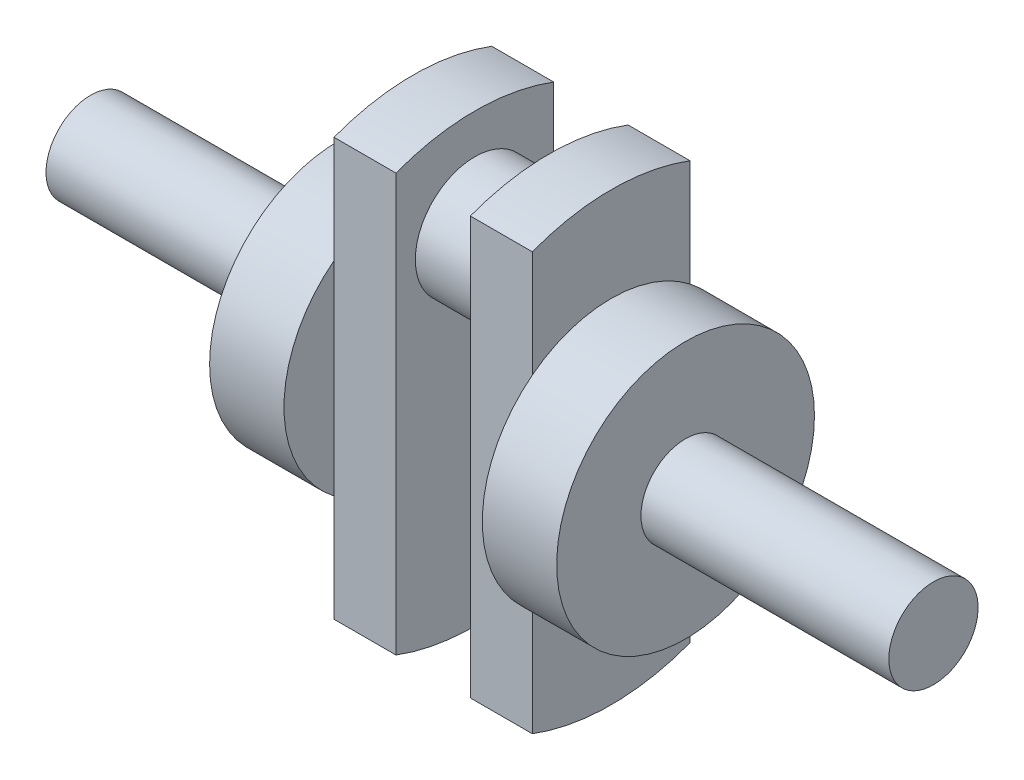
ISO-10303-21;
HEADER;
FILE_DESCRIPTION(('STEP AP214'),'2;1');
FILE_NAME('part.step','',(''),(''),'','','');
FILE_SCHEMA(('AUTOMOTIVE_DESIGN { 1 0 10303 214 1 1 1 1 }'));
ENDSEC;
DATA;
#1=APPLICATION_CONTEXT('core data for automotive mechanical design processes');
#2=APPLICATION_PROTOCOL_DEFINITION('international standard','automotive_design',2000,#1);
#3=PRODUCT_CONTEXT('',#1,'mechanical');
#4=PRODUCT('Part','Part','',(#3));
#5=PRODUCT_RELATED_PRODUCT_CATEGORY('part','',(#4));
#6=PRODUCT_DEFINITION_FORMATION('','',#4);
#7=PRODUCT_DEFINITION_CONTEXT('part definition',#1,'design');
#8=PRODUCT_DEFINITION('design','',#6,#7);
#9=PRODUCT_DEFINITION_SHAPE('','',#8);
#10=(LENGTH_UNIT() NAMED_UNIT(*) SI_UNIT(.MILLI.,.METRE.));
#11=(NAMED_UNIT(*) PLANE_ANGLE_UNIT() SI_UNIT($,.RADIAN.));
#12=(NAMED_UNIT(*) SI_UNIT($,.STERADIAN.) SOLID_ANGLE_UNIT());
#13=UNCERTAINTY_MEASURE_WITH_UNIT(LENGTH_MEASURE(1.E-05),#10,'distance_accuracy_value','');
#14=(GEOMETRIC_REPRESENTATION_CONTEXT(3) GLOBAL_UNCERTAINTY_ASSIGNED_CONTEXT((#13)) GLOBAL_UNIT_ASSIGNED_CONTEXT((#10,
#11,#12)) REPRESENTATION_CONTEXT('',''));
#15=CARTESIAN_POINT('',(0.,0.,0.));
#16=DIRECTION('',(0.,0.,1.));
#17=DIRECTION('',(1.,0.,0.));
#18=AXIS2_PLACEMENT_3D('',#15,#16,#17);
#19=CARTESIAN_POINT('',(40.,25.,0.));
#20=DIRECTION('',(1.,0.,0.));
#21=DIRECTION('',(0.,0.,-1.));
#22=AXIS2_PLACEMENT_3D('',#19,#20,#21);
#23=PLANE('',#22);
#24=DIRECTION('',(0.,1.,0.));
#25=VECTOR('',#24,1.);
#26=CARTESIAN_POINT('',(40.,-42.0948804965013,-15.9066349673736));
#27=LINE('',#26,#25);
#28=CARTESIAN_POINT('',(40.,-42.0948804965013,-15.9066349673736));
#29=VERTEX_POINT('',#28);
#30=CARTESIAN_POINT('',(40.,-20.5664523925427,-15.9066349673736));
#31=VERTEX_POINT('',#30);
#32=EDGE_CURVE('E249',#29,#31,#27,.T.);
#33=ORIENTED_EDGE('',*,*,#32,.T.);
#34=CARTESIAN_POINT('',(40.,0.,0.));
#35=DIRECTION('',(1.,0.,0.));
#36=DIRECTION('',(0.,0.,-1.));
#37=AXIS2_PLACEMENT_3D('',#34,#35,#36);
#38=CIRCLE('',#37,26.);
#39=CARTESIAN_POINT('',(40.,-20.5664523925427,15.9066349673736));
#40=VERTEX_POINT('',#39);
#41=EDGE_CURVE('E40',#31,#40,#38,.F.);
#42=ORIENTED_EDGE('',*,*,#41,.T.);
#43=DIRECTION('',(0.,-1.,0.));
#44=VECTOR('',#43,1.);
#45=CARTESIAN_POINT('',(40.,-42.0948804965013,15.9066349673736));
#46=LINE('',#45,#44);
#47=CARTESIAN_POINT('',(40.,-42.0948804965013,15.9066349673736));
#48=VERTEX_POINT('',#47);
#49=EDGE_CURVE('E141',#40,#48,#46,.T.);
#50=ORIENTED_EDGE('',*,*,#49,.T.);
#51=CARTESIAN_POINT('',(40.,0.,0.));
#52=DIRECTION('',(1.,0.,0.));
#53=DIRECTION('',(0.,0.,-1.));
#54=AXIS2_PLACEMENT_3D('',#51,#52,#53);
#55=CIRCLE('',#54,45.);
#56=EDGE_CURVE('E147',#48,#29,#55,.T.);
#57=ORIENTED_EDGE('',*,*,#56,.T.);
#58=EDGE_LOOP('',(#33,#42,#50,#57));
#59=FACE_BOUND('',#58,.T.);
#60=ADVANCED_FACE('F32',(#59),#23,.T.);
#61=CARTESIAN_POINT('',(40.,42.0948804965013,15.9066349673736));
#62=VERTEX_POINT('',#61);
#63=CARTESIAN_POINT('',(40.,20.5664523925427,15.9066349673736));
#64=VERTEX_POINT('',#63);
#65=EDGE_CURVE('E138',#62,#64,#46,.T.);
#66=ORIENTED_EDGE('',*,*,#65,.T.);
#67=CARTESIAN_POINT('',(40.,0.,0.));
#68=DIRECTION('',(1.,0.,0.));
#69=DIRECTION('',(0.,0.,-1.));
#70=AXIS2_PLACEMENT_3D('',#67,#68,#69);
#71=CIRCLE('',#70,26.);
#72=CARTESIAN_POINT('',(40.,20.5664523925427,-15.9066349673736));
#73=VERTEX_POINT('',#72);
#74=EDGE_CURVE('E126',#73,#64,#71,.T.);
#75=ORIENTED_EDGE('',*,*,#74,.F.);
#76=CARTESIAN_POINT('',(40.,42.0948804965013,-15.9066349673736));
#77=VERTEX_POINT('',#76);
#78=EDGE_CURVE('E148',#73,#77,#27,.T.);
#79=ORIENTED_EDGE('',*,*,#78,.T.);
#80=CARTESIAN_POINT('',(40.,0.,0.));
#81=DIRECTION('',(1.,0.,0.));
#82=DIRECTION('',(0.,0.,-1.));
#83=AXIS2_PLACEMENT_3D('',#80,#81,#82);
#84=CIRCLE('',#83,45.);
#85=EDGE_CURVE('E145',#77,#62,#84,.T.);
#86=ORIENTED_EDGE('',*,*,#85,.T.);
#87=EDGE_LOOP('',(#66,#75,#79,#86));
#88=FACE_BOUND('',#87,.T.);
#89=ADVANCED_FACE('F143',(#88),#23,.T.);
#90=CARTESIAN_POINT('',(0.,0.,0.));
#91=DIRECTION('',(1.,0.,0.));
#92=DIRECTION('',(0.,0.,-1.));
#93=AXIS2_PLACEMENT_3D('',#90,#91,#92);
#94=PLANE('',#93);
#95=CARTESIAN_POINT('',(0.,0.,0.));
#96=DIRECTION('',(-1.,0.,0.));
#97=DIRECTION('',(0.,0.,1.));
#98=AXIS2_PLACEMENT_3D('',#95,#96,#97);
#99=CIRCLE('',#98,26.);
#100=CARTESIAN_POINT('',(0.,-20.5664523925427,-15.9066349673736));
#101=VERTEX_POINT('',#100);
#102=CARTESIAN_POINT('',(0.,-20.5664523925427,15.9066349673736));
#103=VERTEX_POINT('',#102);
#104=EDGE_CURVE('E182',#101,#103,#99,.T.);
#105=ORIENTED_EDGE('',*,*,#104,.F.);
#106=DIRECTION('',(0.,1.,0.));
#107=VECTOR('',#106,1.);
#108=CARTESIAN_POINT('',(0.,-42.0948804965013,-15.9066349673736));
#109=LINE('',#108,#107);
#110=CARTESIAN_POINT('',(0.,-42.0948804965013,-15.9066349673736));
#111=VERTEX_POINT('',#110);
#112=EDGE_CURVE('E199',#111,#101,#109,.T.);
#113=ORIENTED_EDGE('',*,*,#112,.F.);
#114=CARTESIAN_POINT('',(0.,0.,0.));
#115=DIRECTION('',(1.,0.,0.));
#116=DIRECTION('',(0.,0.,-1.));
#117=AXIS2_PLACEMENT_3D('',#114,#115,#116);
#118=CIRCLE('',#117,45.);
#119=CARTESIAN_POINT('',(0.,-42.0948804965013,15.9066349673736));
#120=VERTEX_POINT('',#119);
#121=EDGE_CURVE('E215',#120,#111,#118,.T.);
#122=ORIENTED_EDGE('',*,*,#121,.F.);
#123=DIRECTION('',(0.,-1.,0.));
#124=VECTOR('',#123,1.);
#125=CARTESIAN_POINT('',(0.,-42.0948804965013,15.9066349673736));
#126=LINE('',#125,#124);
#127=EDGE_CURVE('E55',#103,#120,#126,.T.);
#128=ORIENTED_EDGE('',*,*,#127,.F.);
#129=EDGE_LOOP('',(#105,#113,#122,#128));
#130=FACE_BOUND('',#129,.T.);
#131=ADVANCED_FACE('F297',(#130),#94,.F.);
#132=CARTESIAN_POINT('',(0.,20.5664523925427,15.9066349673736));
#133=VERTEX_POINT('',#132);
#134=CARTESIAN_POINT('',(0.,20.5664523925427,-15.9066349673736));
#135=VERTEX_POINT('',#134);
#136=EDGE_CURVE('E171',#133,#135,#99,.T.);
#137=ORIENTED_EDGE('',*,*,#136,.F.);
#138=CARTESIAN_POINT('',(0.,42.0948804965013,15.9066349673736));
#139=VERTEX_POINT('',#138);
#140=EDGE_CURVE('E219',#139,#133,#126,.T.);
#141=ORIENTED_EDGE('',*,*,#140,.F.);
#142=CARTESIAN_POINT('',(0.,0.,0.));
#143=DIRECTION('',(1.,0.,0.));
#144=DIRECTION('',(0.,0.,-1.));
#145=AXIS2_PLACEMENT_3D('',#142,#143,#144);
#146=CIRCLE('',#145,45.);
#147=CARTESIAN_POINT('',(0.,42.0948804965013,-15.9066349673736));
#148=VERTEX_POINT('',#147);
#149=EDGE_CURVE('E206',#148,#139,#146,.T.);
#150=ORIENTED_EDGE('',*,*,#149,.F.);
#151=EDGE_CURVE('E196',#135,#148,#109,.T.);
#152=ORIENTED_EDGE('',*,*,#151,.F.);
#153=EDGE_LOOP('',(#137,#141,#150,#152));
#154=FACE_BOUND('',#153,.T.);
#155=ADVANCED_FACE('F202',(#154),#94,.F.);
#156=CARTESIAN_POINT('',(-33.9411254969543,25.,0.));
#157=DIRECTION('',(1.,0.,0.));
#158=DIRECTION('',(0.,0.,-1.));
#159=AXIS2_PLACEMENT_3D('',#156,#157,#158);
#160=CYLINDRICAL_SURFACE('',#159,12.);
#161=CARTESIAN_POINT('',(12.5,25.,0.));
#162=DIRECTION('',(-1.,0.,0.));
#163=DIRECTION('',(0.,-1.,0.));
#164=AXIS2_PLACEMENT_3D('',#161,#162,#163);
#165=CIRCLE('',#164,12.);
#166=CARTESIAN_POINT('',(12.5,13.,0.));
#167=VERTEX_POINT('',#166);
#168=EDGE_CURVE('E231',#167,#167,#165,.T.);
#169=ORIENTED_EDGE('',*,*,#168,.F.);
#170=EDGE_LOOP('',(#169));
#171=FACE_BOUND('',#170,.T.);
#172=CARTESIAN_POINT('',(27.5,25.,0.));
#173=DIRECTION('',(1.,0.,0.));
#174=DIRECTION('',(0.,1.,0.));
#175=AXIS2_PLACEMENT_3D('',#172,#173,#174);
#176=CIRCLE('',#175,12.);
#177=CARTESIAN_POINT('',(27.5,37.,0.));
#178=VERTEX_POINT('',#177);
#179=EDGE_CURVE('E242',#178,#178,#176,.F.);
#180=ORIENTED_EDGE('',*,*,#179,.T.);
#181=EDGE_LOOP('',(#180));
#182=FACE_BOUND('',#181,.T.);
#183=ADVANCED_FACE('F300',(#171,#182),#160,.T.);
#184=CARTESIAN_POINT('',(40.,0.,0.));
#185=DIRECTION('',(-1.,0.,0.));
#186=DIRECTION('',(0.,0.,1.));
#187=AXIS2_PLACEMENT_3D('',#184,#185,#186);
#188=CYLINDRICAL_SURFACE('',#187,45.);
#189=DIRECTION('',(-1.,0.,0.));
#190=VECTOR('',#189,1.);
#191=CARTESIAN_POINT('',(40.,42.0948804965013,15.9066349673736));
#192=LINE('',#191,#190);
#193=CARTESIAN_POINT('',(12.5,42.0948804965013,15.9066349673736));
#194=VERTEX_POINT('',#193);
#195=EDGE_CURVE('E223',#194,#139,#192,.T.);
#196=ORIENTED_EDGE('',*,*,#195,.F.);
#197=CARTESIAN_POINT('',(12.5,0.,0.));
#198=DIRECTION('',(-1.,0.,0.));
#199=DIRECTION('',(0.,-1.,0.));
#200=AXIS2_PLACEMENT_3D('',#197,#198,#199);
#201=CIRCLE('',#200,45.);
#202=CARTESIAN_POINT('',(12.5,42.0948804965013,-15.9066349673736));
#203=VERTEX_POINT('',#202);
#204=EDGE_CURVE('E228',#194,#203,#201,.T.);
#205=ORIENTED_EDGE('',*,*,#204,.T.);
#206=DIRECTION('',(-1.,0.,0.));
#207=VECTOR('',#206,1.);
#208=CARTESIAN_POINT('',(40.,42.0948804965013,-15.9066349673736));
#209=LINE('',#208,#207);
#210=EDGE_CURVE('E224',#203,#148,#209,.T.);
#211=ORIENTED_EDGE('',*,*,#210,.T.);
#212=ORIENTED_EDGE('',*,*,#149,.T.);
#213=EDGE_LOOP('',(#196,#205,#211,#212));
#214=FACE_BOUND('',#213,.T.);
#215=ADVANCED_FACE('F34',(#214),#188,.T.);
#216=CARTESIAN_POINT('',(40.,-42.0948804965013,15.9066349673736));
#217=DIRECTION('',(0.,0.,-1.));
#218=DIRECTION('',(-1.,0.,0.));
#219=AXIS2_PLACEMENT_3D('',#216,#217,#218);
#220=PLANE('',#219);
#221=DIRECTION('',(-1.,0.,0.));
#222=VECTOR('',#221,1.);
#223=CARTESIAN_POINT('',(40.,-42.0948804965013,15.9066349673736));
#224=LINE('',#223,#222);
#225=CARTESIAN_POINT('',(12.5,-42.0948804965013,15.9066349673736));
#226=VERTEX_POINT('',#225);
#227=EDGE_CURVE('E218',#226,#120,#224,.T.);
#228=ORIENTED_EDGE('',*,*,#227,.F.);
#229=DIRECTION('',(0.,-1.,0.));
#230=VECTOR('',#229,1.);
#231=CARTESIAN_POINT('',(12.5,65.7291414579238,15.9066349673736));
#232=LINE('',#231,#230);
#233=EDGE_CURVE('E227',#194,#226,#232,.T.);
#234=ORIENTED_EDGE('',*,*,#233,.F.);
#235=ORIENTED_EDGE('',*,*,#195,.T.);
#236=ORIENTED_EDGE('',*,*,#140,.T.);
#237=DIRECTION('',(0.,1.,0.));
#238=VECTOR('',#237,1.);
#239=CARTESIAN_POINT('',(0.,-42.0948804965013,15.9066349673736));
#240=LINE('',#239,#238);
#241=EDGE_CURVE('E164',#103,#133,#240,.T.);
#242=ORIENTED_EDGE('',*,*,#241,.F.);
#243=ORIENTED_EDGE('',*,*,#127,.T.);
#244=EDGE_LOOP('',(#228,#234,#235,#236,#242,#243));
#245=FACE_BOUND('',#244,.T.);
#246=ADVANCED_FACE('F324',(#245),#220,.F.);
#247=CARTESIAN_POINT('',(40.,0.,0.));
#248=DIRECTION('',(-1.,0.,0.));
#249=DIRECTION('',(0.,0.,1.));
#250=AXIS2_PLACEMENT_3D('',#247,#248,#249);
#251=CYLINDRICAL_SURFACE('',#250,45.);
#252=DIRECTION('',(-1.,0.,0.));
#253=VECTOR('',#252,1.);
#254=CARTESIAN_POINT('',(40.,-42.0948804965013,-15.9066349673736));
#255=LINE('',#254,#253);
#256=CARTESIAN_POINT('',(12.5,-42.0948804965013,-15.9066349673736));
#257=VERTEX_POINT('',#256);
#258=EDGE_CURVE('E207',#257,#111,#255,.T.);
#259=ORIENTED_EDGE('',*,*,#258,.F.);
#260=CARTESIAN_POINT('',(12.5,0.,0.));
#261=DIRECTION('',(-1.,0.,0.));
#262=DIRECTION('',(0.,-1.,0.));
#263=AXIS2_PLACEMENT_3D('',#260,#261,#262);
#264=CIRCLE('',#263,45.);
#265=EDGE_CURVE('E221',#257,#226,#264,.T.);
#266=ORIENTED_EDGE('',*,*,#265,.T.);
#267=ORIENTED_EDGE('',*,*,#227,.T.);
#268=ORIENTED_EDGE('',*,*,#121,.T.);
#269=EDGE_LOOP('',(#259,#266,#267,#268));
#270=FACE_BOUND('',#269,.T.);
#271=ADVANCED_FACE('F322',(#270),#251,.T.);
#272=CARTESIAN_POINT('',(40.,-42.0948804965013,-15.9066349673736));
#273=DIRECTION('',(0.,0.,1.));
#274=DIRECTION('',(1.,0.,0.));
#275=AXIS2_PLACEMENT_3D('',#272,#273,#274);
#276=PLANE('',#275);
#277=ORIENTED_EDGE('',*,*,#210,.F.);
#278=DIRECTION('',(0.,-1.,0.));
#279=VECTOR('',#278,1.);
#280=CARTESIAN_POINT('',(12.5,-42.0948804965013,-15.9066349673736));
#281=LINE('',#280,#279);
#282=EDGE_CURVE('E210',#203,#257,#281,.T.);
#283=ORIENTED_EDGE('',*,*,#282,.T.);
#284=ORIENTED_EDGE('',*,*,#258,.T.);
#285=ORIENTED_EDGE('',*,*,#112,.T.);
#286=DIRECTION('',(0.,-1.,0.));
#287=VECTOR('',#286,1.);
#288=CARTESIAN_POINT('',(0.,-42.0948804965013,-15.9066349673736));
#289=LINE('',#288,#287);
#290=EDGE_CURVE('E167',#135,#101,#289,.T.);
#291=ORIENTED_EDGE('',*,*,#290,.F.);
#292=ORIENTED_EDGE('',*,*,#151,.T.);
#293=EDGE_LOOP('',(#277,#283,#284,#285,#291,#292));
#294=FACE_BOUND('',#293,.T.);
#295=ADVANCED_FACE('F195',(#294),#276,.F.);
#296=CARTESIAN_POINT('',(12.5,65.7291414579238,-146.769158250398));
#297=DIRECTION('',(-1.,0.,0.));
#298=DIRECTION('',(0.,-1.,0.));
#299=AXIS2_PLACEMENT_3D('',#296,#297,#298);
#300=PLANE('',#299);
#301=ORIENTED_EDGE('',*,*,#168,.T.);
#302=EDGE_LOOP('',(#301));
#303=FACE_BOUND('',#302,.T.);
#304=ORIENTED_EDGE('',*,*,#233,.T.);
#305=ORIENTED_EDGE('',*,*,#265,.F.);
#306=ORIENTED_EDGE('',*,*,#282,.F.);
#307=ORIENTED_EDGE('',*,*,#204,.F.);
#308=EDGE_LOOP('',(#304,#305,#306,#307));
#309=FACE_BOUND('',#308,.T.);
#310=ADVANCED_FACE('F312',(#303,#309),#300,.F.);
#311=CARTESIAN_POINT('',(40.,-42.0948804965013,-15.9066349673736));
#312=DIRECTION('',(0.,0.,1.));
#313=DIRECTION('',(1.,0.,0.));
#314=AXIS2_PLACEMENT_3D('',#311,#312,#313);
#315=PLANE('',#314);
#316=DIRECTION('',(-1.,0.,0.));
#317=VECTOR('',#316,1.);
#318=CARTESIAN_POINT('',(40.,-42.0948804965013,-15.9066349673736));
#319=LINE('',#318,#317);
#320=CARTESIAN_POINT('',(27.5,-42.0948804965013,-15.9066349673736));
#321=VERTEX_POINT('',#320);
#322=EDGE_CURVE('E262',#29,#321,#319,.T.);
#323=ORIENTED_EDGE('',*,*,#322,.T.);
#324=DIRECTION('',(0.,1.,0.));
#325=VECTOR('',#324,1.);
#326=CARTESIAN_POINT('',(27.5,-42.0948804965013,-15.9066349673736));
#327=LINE('',#326,#325);
#328=CARTESIAN_POINT('',(27.5,42.0948804965013,-15.9066349673736));
#329=VERTEX_POINT('',#328);
#330=EDGE_CURVE('E245',#321,#329,#327,.T.);
#331=ORIENTED_EDGE('',*,*,#330,.T.);
#332=DIRECTION('',(-1.,0.,0.));
#333=VECTOR('',#332,1.);
#334=CARTESIAN_POINT('',(40.,42.0948804965013,-15.9066349673736));
#335=LINE('',#334,#333);
#336=EDGE_CURVE('E258',#77,#329,#335,.T.);
#337=ORIENTED_EDGE('',*,*,#336,.F.);
#338=ORIENTED_EDGE('',*,*,#78,.F.);
#339=EDGE_CURVE('E252',#31,#73,#27,.T.);
#340=ORIENTED_EDGE('',*,*,#339,.F.);
#341=ORIENTED_EDGE('',*,*,#32,.F.);
#342=EDGE_LOOP('',(#323,#331,#337,#338,#340,#341));
#343=FACE_BOUND('',#342,.T.);
#344=ADVANCED_FACE('F254',(#343),#315,.F.);
#345=CARTESIAN_POINT('',(40.,0.,0.));
#346=DIRECTION('',(-1.,0.,0.));
#347=DIRECTION('',(0.,0.,1.));
#348=AXIS2_PLACEMENT_3D('',#345,#346,#347);
#349=CYLINDRICAL_SURFACE('',#348,45.);
#350=DIRECTION('',(-1.,0.,0.));
#351=VECTOR('',#350,1.);
#352=CARTESIAN_POINT('',(40.,-42.0948804965013,15.9066349673736));
#353=LINE('',#352,#351);
#354=CARTESIAN_POINT('',(27.5,-42.0948804965013,15.9066349673736));
#355=VERTEX_POINT('',#354);
#356=EDGE_CURVE('E264',#48,#355,#353,.T.);
#357=ORIENTED_EDGE('',*,*,#356,.T.);
#358=CARTESIAN_POINT('',(27.5,0.,0.));
#359=DIRECTION('',(1.,0.,0.));
#360=DIRECTION('',(0.,1.,0.));
#361=AXIS2_PLACEMENT_3D('',#358,#359,#360);
#362=CIRCLE('',#361,45.);
#363=EDGE_CURVE('E159',#355,#321,#362,.T.);
#364=ORIENTED_EDGE('',*,*,#363,.T.);
#365=ORIENTED_EDGE('',*,*,#322,.F.);
#366=ORIENTED_EDGE('',*,*,#56,.F.);
#367=EDGE_LOOP('',(#357,#364,#365,#366));
#368=FACE_BOUND('',#367,.T.);
#369=ADVANCED_FACE('F276',(#368),#349,.T.);
#370=CARTESIAN_POINT('',(40.,-42.0948804965013,15.9066349673736));
#371=DIRECTION('',(0.,0.,-1.));
#372=DIRECTION('',(-1.,0.,0.));
#373=AXIS2_PLACEMENT_3D('',#370,#371,#372);
#374=PLANE('',#373);
#375=DIRECTION('',(-1.,0.,0.));
#376=VECTOR('',#375,1.);
#377=CARTESIAN_POINT('',(40.,42.0948804965013,15.9066349673736));
#378=LINE('',#377,#376);
#379=CARTESIAN_POINT('',(27.5,42.0948804965013,15.9066349673736));
#380=VERTEX_POINT('',#379);
#381=EDGE_CURVE('E267',#62,#380,#378,.T.);
#382=ORIENTED_EDGE('',*,*,#381,.T.);
#383=DIRECTION('',(0.,1.,0.));
#384=VECTOR('',#383,1.);
#385=CARTESIAN_POINT('',(27.5,65.7291414579239,15.9066349673736));
#386=LINE('',#385,#384);
#387=EDGE_CURVE('E162',#355,#380,#386,.T.);
#388=ORIENTED_EDGE('',*,*,#387,.F.);
#389=ORIENTED_EDGE('',*,*,#356,.F.);
#390=ORIENTED_EDGE('',*,*,#49,.F.);
#391=EDGE_CURVE('E124',#64,#40,#46,.T.);
#392=ORIENTED_EDGE('',*,*,#391,.F.);
#393=ORIENTED_EDGE('',*,*,#65,.F.);
#394=EDGE_LOOP('',(#382,#388,#389,#390,#392,#393));
#395=FACE_BOUND('',#394,.T.);
#396=ADVANCED_FACE('F137',(#395),#374,.F.);
#397=CARTESIAN_POINT('',(40.,0.,0.));
#398=DIRECTION('',(-1.,0.,0.));
#399=DIRECTION('',(0.,0.,1.));
#400=AXIS2_PLACEMENT_3D('',#397,#398,#399);
#401=CYLINDRICAL_SURFACE('',#400,45.);
#402=ORIENTED_EDGE('',*,*,#336,.T.);
#403=CARTESIAN_POINT('',(27.5,0.,0.));
#404=DIRECTION('',(1.,0.,0.));
#405=DIRECTION('',(0.,1.,0.));
#406=AXIS2_PLACEMENT_3D('',#403,#404,#405);
#407=CIRCLE('',#406,45.);
#408=EDGE_CURVE('E154',#329,#380,#407,.T.);
#409=ORIENTED_EDGE('',*,*,#408,.T.);
#410=ORIENTED_EDGE('',*,*,#381,.F.);
#411=ORIENTED_EDGE('',*,*,#85,.F.);
#412=EDGE_LOOP('',(#402,#409,#410,#411));
#413=FACE_BOUND('',#412,.T.);
#414=ADVANCED_FACE('F272',(#413),#401,.T.);
#415=CARTESIAN_POINT('',(27.5,65.7291414579239,-146.769158250398));
#416=DIRECTION('',(1.,0.,0.));
#417=DIRECTION('',(0.,1.,0.));
#418=AXIS2_PLACEMENT_3D('',#415,#416,#417);
#419=PLANE('',#418);
#420=ORIENTED_EDGE('',*,*,#179,.F.);
#421=EDGE_LOOP('',(#420));
#422=FACE_BOUND('',#421,.T.);
#423=ORIENTED_EDGE('',*,*,#330,.F.);
#424=ORIENTED_EDGE('',*,*,#363,.F.);
#425=ORIENTED_EDGE('',*,*,#387,.T.);
#426=ORIENTED_EDGE('',*,*,#408,.F.);
#427=EDGE_LOOP('',(#423,#424,#425,#426));
#428=FACE_BOUND('',#427,.T.);
#429=ADVANCED_FACE('F277',(#422,#428),#419,.F.);
#430=CARTESIAN_POINT('',(0.,0.,0.));
#431=DIRECTION('',(-1.,0.,0.));
#432=DIRECTION('',(0.,0.,1.));
#433=AXIS2_PLACEMENT_3D('',#430,#431,#432);
#434=PLANE('',#433);
#435=EDGE_CURVE('E175',#103,#133,#99,.T.);
#436=ORIENTED_EDGE('',*,*,#435,.F.);
#437=ORIENTED_EDGE('',*,*,#241,.T.);
#438=EDGE_LOOP('',(#436,#437));
#439=FACE_BOUND('',#438,.T.);
#440=ADVANCED_FACE('F279',(#439),#434,.F.);
#441=EDGE_CURVE('E174',#135,#101,#99,.T.);
#442=ORIENTED_EDGE('',*,*,#441,.F.);
#443=ORIENTED_EDGE('',*,*,#290,.T.);
#444=EDGE_LOOP('',(#442,#443));
#445=FACE_BOUND('',#444,.T.);
#446=ADVANCED_FACE('F190',(#445),#434,.F.);
#447=CARTESIAN_POINT('',(-15.,0.,0.));
#448=DIRECTION('',(1.,0.,0.));
#449=DIRECTION('',(0.,0.,-1.));
#450=AXIS2_PLACEMENT_3D('',#447,#448,#449);
#451=CYLINDRICAL_SURFACE('',#450,26.);
#452=CARTESIAN_POINT('',(-15.,0.,0.));
#453=DIRECTION('',(-1.,0.,0.));
#454=DIRECTION('',(0.,0.,1.));
#455=AXIS2_PLACEMENT_3D('',#452,#453,#454);
#456=CIRCLE('',#455,26.);
#457=CARTESIAN_POINT('',(-15.,0.,26.));
#458=VERTEX_POINT('',#457);
#459=EDGE_CURVE('E170',#458,#458,#456,.T.);
#460=ORIENTED_EDGE('',*,*,#459,.F.);
#461=EDGE_LOOP('',(#460));
#462=FACE_BOUND('',#461,.T.);
#463=ORIENTED_EDGE('',*,*,#136,.T.);
#464=ORIENTED_EDGE('',*,*,#441,.T.);
#465=ORIENTED_EDGE('',*,*,#104,.T.);
#466=ORIENTED_EDGE('',*,*,#435,.T.);
#467=EDGE_LOOP('',(#463,#464,#465,#466));
#468=FACE_BOUND('',#467,.T.);
#469=ADVANCED_FACE('F188',(#462,#468),#451,.T.);
#470=CARTESIAN_POINT('',(-15.,0.,0.));
#471=DIRECTION('',(-1.,0.,0.));
#472=DIRECTION('',(0.,0.,1.));
#473=AXIS2_PLACEMENT_3D('',#470,#471,#472);
#474=PLANE('',#473);
#475=CARTESIAN_POINT('',(-15.,0.,0.));
#476=DIRECTION('',(-1.,0.,0.));
#477=DIRECTION('',(0.,0.,1.));
#478=AXIS2_PLACEMENT_3D('',#475,#476,#477);
#479=CIRCLE('',#478,9.);
#480=CARTESIAN_POINT('',(-15.,0.,9.));
#481=VERTEX_POINT('',#480);
#482=EDGE_CURVE('E235',#481,#481,#479,.F.);
#483=ORIENTED_EDGE('',*,*,#482,.T.);
#484=EDGE_LOOP('',(#483));
#485=FACE_BOUND('',#484,.T.);
#486=ORIENTED_EDGE('',*,*,#459,.T.);
#487=EDGE_LOOP('',(#486));
#488=FACE_BOUND('',#487,.T.);
#489=ADVANCED_FACE('F310',(#485,#488),#474,.T.);
#490=CARTESIAN_POINT('',(-65.,0.,0.));
#491=DIRECTION('',(-1.,0.,0.));
#492=DIRECTION('',(0.,0.,1.));
#493=AXIS2_PLACEMENT_3D('',#490,#491,#492);
#494=PLANE('',#493);
#495=CARTESIAN_POINT('',(-65.,0.,0.));
#496=DIRECTION('',(-1.,0.,0.));
#497=DIRECTION('',(0.,0.,1.));
#498=AXIS2_PLACEMENT_3D('',#495,#496,#497);
#499=CIRCLE('',#498,9.);
#500=CARTESIAN_POINT('',(-65.,0.,9.));
#501=VERTEX_POINT('',#500);
#502=EDGE_CURVE('E209',#501,#501,#499,.T.);
#503=ORIENTED_EDGE('',*,*,#502,.T.);
#504=EDGE_LOOP('',(#503));
#505=FACE_BOUND('',#504,.T.);
#506=ADVANCED_FACE('F306',(#505),#494,.T.);
#507=CARTESIAN_POINT('',(105.,0.,0.));
#508=DIRECTION('',(-1.,0.,0.));
#509=DIRECTION('',(0.,0.,1.));
#510=AXIS2_PLACEMENT_3D('',#507,#508,#509);
#511=CYLINDRICAL_SURFACE('',#510,9.);
#512=ORIENTED_EDGE('',*,*,#482,.F.);
#513=EDGE_LOOP('',(#512));
#514=FACE_BOUND('',#513,.T.);
#515=ORIENTED_EDGE('',*,*,#502,.F.);
#516=EDGE_LOOP('',(#515));
#517=FACE_BOUND('',#516,.T.);
#518=ADVANCED_FACE('F309',(#514,#517),#511,.T.);
#519=CARTESIAN_POINT('',(40.,0.,0.));
#520=DIRECTION('',(1.,0.,0.));
#521=DIRECTION('',(0.,0.,-1.));
#522=AXIS2_PLACEMENT_3D('',#519,#520,#521);
#523=PLANE('',#522);
#524=EDGE_CURVE('E47',#31,#73,#71,.T.);
#525=ORIENTED_EDGE('',*,*,#524,.F.);
#526=ORIENTED_EDGE('',*,*,#339,.T.);
#527=EDGE_LOOP('',(#525,#526));
#528=FACE_BOUND('',#527,.T.);
#529=ADVANCED_FACE('F318',(#528),#523,.F.);
#530=EDGE_CURVE('E121',#64,#40,#71,.T.);
#531=ORIENTED_EDGE('',*,*,#530,.F.);
#532=ORIENTED_EDGE('',*,*,#391,.T.);
#533=EDGE_LOOP('',(#531,#532));
#534=FACE_BOUND('',#533,.T.);
#535=ADVANCED_FACE('F122',(#534),#523,.F.);
#536=CARTESIAN_POINT('',(55.,0.,0.));
#537=DIRECTION('',(-1.,0.,0.));
#538=DIRECTION('',(0.,0.,1.));
#539=AXIS2_PLACEMENT_3D('',#536,#537,#538);
#540=CYLINDRICAL_SURFACE('',#539,26.);
#541=CARTESIAN_POINT('',(55.,0.,0.));
#542=DIRECTION('',(1.,0.,0.));
#543=DIRECTION('',(0.,0.,-1.));
#544=AXIS2_PLACEMENT_3D('',#541,#542,#543);
#545=CIRCLE('',#544,26.);
#546=CARTESIAN_POINT('',(55.,0.,-26.));
#547=VERTEX_POINT('',#546);
#548=EDGE_CURVE('E133',#547,#547,#545,.T.);
#549=ORIENTED_EDGE('',*,*,#548,.F.);
#550=EDGE_LOOP('',(#549));
#551=FACE_BOUND('',#550,.T.);
#552=ORIENTED_EDGE('',*,*,#74,.T.);
#553=ORIENTED_EDGE('',*,*,#530,.T.);
#554=ORIENTED_EDGE('',*,*,#41,.F.);
#555=ORIENTED_EDGE('',*,*,#524,.T.);
#556=EDGE_LOOP('',(#552,#553,#554,#555));
#557=FACE_BOUND('',#556,.T.);
#558=ADVANCED_FACE('F129',(#551,#557),#540,.T.);
#559=CARTESIAN_POINT('',(55.,0.,0.));
#560=DIRECTION('',(1.,0.,0.));
#561=DIRECTION('',(0.,0.,-1.));
#562=AXIS2_PLACEMENT_3D('',#559,#560,#561);
#563=PLANE('',#562);
#564=CARTESIAN_POINT('',(55.,0.,0.));
#565=DIRECTION('',(1.,0.,0.));
#566=DIRECTION('',(0.,0.,-1.));
#567=AXIS2_PLACEMENT_3D('',#564,#565,#566);
#568=CIRCLE('',#567,9.);
#569=CARTESIAN_POINT('',(55.,0.,-9.));
#570=VERTEX_POINT('',#569);
#571=EDGE_CURVE('E11',#570,#570,#568,.F.);
#572=ORIENTED_EDGE('',*,*,#571,.T.);
#573=EDGE_LOOP('',(#572));
#574=FACE_BOUND('',#573,.T.);
#575=ORIENTED_EDGE('',*,*,#548,.T.);
#576=EDGE_LOOP('',(#575));
#577=FACE_BOUND('',#576,.T.);
#578=ADVANCED_FACE('F408',(#574,#577),#563,.T.);
#579=CARTESIAN_POINT('',(105.,0.,0.));
#580=DIRECTION('',(-1.,0.,0.));
#581=DIRECTION('',(0.,0.,1.));
#582=AXIS2_PLACEMENT_3D('',#579,#580,#581);
#583=PLANE('',#582);
#584=CARTESIAN_POINT('',(105.,0.,0.));
#585=DIRECTION('',(-1.,0.,0.));
#586=DIRECTION('',(0.,0.,1.));
#587=AXIS2_PLACEMENT_3D('',#584,#585,#586);
#588=CIRCLE('',#587,9.);
#589=CARTESIAN_POINT('',(105.,0.,9.));
#590=VERTEX_POINT('',#589);
#591=EDGE_CURVE('E152',#590,#590,#588,.T.);
#592=ORIENTED_EDGE('',*,*,#591,.F.);
#593=EDGE_LOOP('',(#592));
#594=FACE_BOUND('',#593,.T.);
#595=ADVANCED_FACE('F418',(#594),#583,.F.);
#596=CARTESIAN_POINT('',(105.,0.,0.));
#597=DIRECTION('',(-1.,0.,0.));
#598=DIRECTION('',(0.,0.,1.));
#599=AXIS2_PLACEMENT_3D('',#596,#597,#598);
#600=CYLINDRICAL_SURFACE('',#599,9.);
#601=ORIENTED_EDGE('',*,*,#571,.F.);
#602=EDGE_LOOP('',(#601));
#603=FACE_BOUND('',#602,.T.);
#604=ORIENTED_EDGE('',*,*,#591,.T.);
#605=EDGE_LOOP('',(#604));
#606=FACE_BOUND('',#605,.T.);
#607=ADVANCED_FACE('F425',(#603,#606),#600,.T.);
#608=CLOSED_SHELL('',(#60,#89,#131,#155,#183,#215,#246,#271,#295,#310,#344,#369,#396,#414,#429,
#440,#446,#469,#489,#506,#518,#529,#535,#558,#578,#595,#607));
#609=MANIFOLD_SOLID_BREP('B2',#608);
#610=ADVANCED_BREP_SHAPE_REPRESENTATION('',(#18,#609),#14);
#611=SHAPE_DEFINITION_REPRESENTATION(#9,#610);
ENDSEC;
END-ISO-10303-21;
